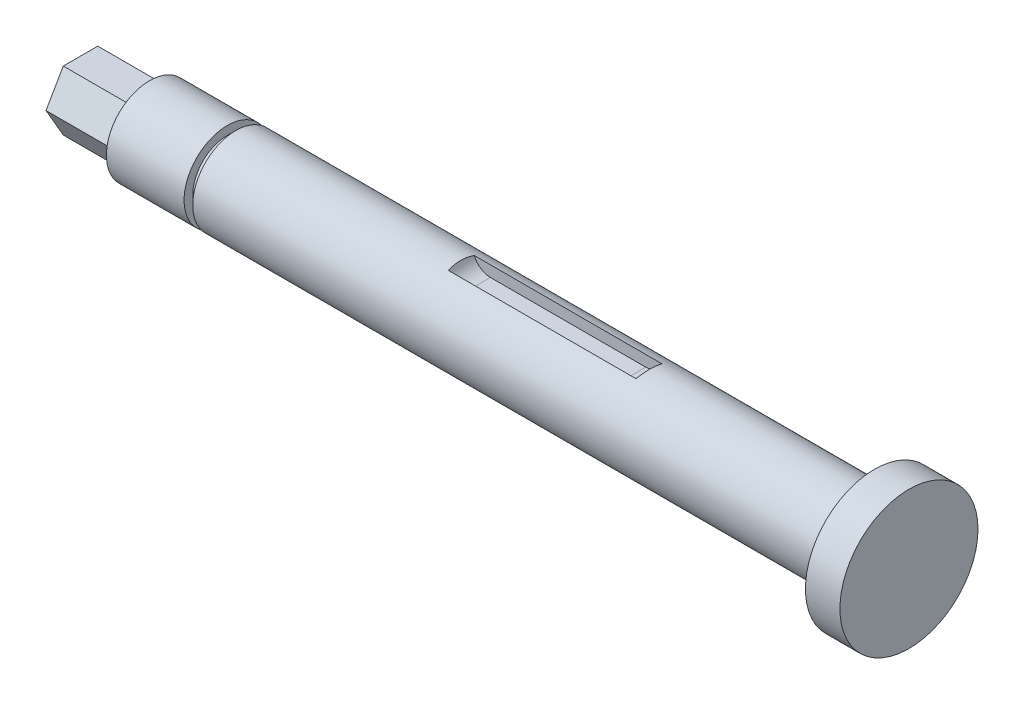
ISO-10303-21;
HEADER;
FILE_DESCRIPTION(('STEP AP214'),'2;1');
FILE_NAME('part.step','',(''),(''),'','','');
FILE_SCHEMA(('AUTOMOTIVE_DESIGN { 1 0 10303 214 1 1 1 1 }'));
ENDSEC;
DATA;
#1=APPLICATION_CONTEXT('core data for automotive mechanical design processes');
#2=APPLICATION_PROTOCOL_DEFINITION('international standard','automotive_design',2000,#1);
#3=PRODUCT_CONTEXT('',#1,'mechanical');
#4=PRODUCT('Part','Part','',(#3));
#5=PRODUCT_RELATED_PRODUCT_CATEGORY('part','',(#4));
#6=PRODUCT_DEFINITION_FORMATION('','',#4);
#7=PRODUCT_DEFINITION_CONTEXT('part definition',#1,'design');
#8=PRODUCT_DEFINITION('design','',#6,#7);
#9=PRODUCT_DEFINITION_SHAPE('','',#8);
#10=(LENGTH_UNIT() NAMED_UNIT(*) SI_UNIT(.MILLI.,.METRE.));
#11=(NAMED_UNIT(*) PLANE_ANGLE_UNIT() SI_UNIT($,.RADIAN.));
#12=(NAMED_UNIT(*) SI_UNIT($,.STERADIAN.) SOLID_ANGLE_UNIT());
#13=UNCERTAINTY_MEASURE_WITH_UNIT(LENGTH_MEASURE(1.E-05),#10,'distance_accuracy_value','');
#14=(GEOMETRIC_REPRESENTATION_CONTEXT(3) GLOBAL_UNCERTAINTY_ASSIGNED_CONTEXT((#13)) GLOBAL_UNIT_ASSIGNED_CONTEXT((#10,
#11,#12)) REPRESENTATION_CONTEXT('',''));
#15=CARTESIAN_POINT('',(0.,0.,0.));
#16=DIRECTION('',(0.,0.,1.));
#17=DIRECTION('',(1.,0.,0.));
#18=AXIS2_PLACEMENT_3D('',#15,#16,#17);
#19=CARTESIAN_POINT('',(0.,0.,0.));
#20=DIRECTION('',(1.,0.,0.));
#21=DIRECTION('',(0.,0.,-1.));
#22=AXIS2_PLACEMENT_3D('',#19,#20,#21);
#23=CYLINDRICAL_SURFACE('',#22,7.9375);
#24=CARTESIAN_POINT('',(28.575,0.,0.));
#25=DIRECTION('',(1.,0.,0.));
#26=DIRECTION('',(0.,0.,-1.));
#27=AXIS2_PLACEMENT_3D('',#24,#25,#26);
#28=CIRCLE('',#27,7.9375);
#29=CARTESIAN_POINT('',(28.575,0.,-7.9375));
#30=VERTEX_POINT('',#29);
#31=EDGE_CURVE('E184',#30,#30,#28,.T.);
#32=ORIENTED_EDGE('',*,*,#31,.T.);
#33=EDGE_LOOP('',(#32));
#34=FACE_BOUND('',#33,.T.);
#35=CARTESIAN_POINT('',(146.05,0.,0.));
#36=DIRECTION('',(1.,0.,0.));
#37=DIRECTION('',(0.,0.,-1.));
#38=AXIS2_PLACEMENT_3D('',#35,#36,#37);
#39=CIRCLE('',#38,7.9375);
#40=CARTESIAN_POINT('',(146.05,0.,-7.9375));
#41=VERTEX_POINT('',#40);
#42=EDGE_CURVE('E181',#41,#41,#39,.T.);
#43=ORIENTED_EDGE('',*,*,#42,.F.);
#44=EDGE_LOOP('',(#43));
#45=FACE_BOUND('',#44,.T.);
#46=CARTESIAN_POINT('',(70.0667575318649,7.57189241124701,-2.38125));
#47=CARTESIAN_POINT('',(70.0547077003656,7.60283748159561,-2.28286114644571));
#48=CARTESIAN_POINT('',(70.0439278662388,7.63190103640766,-2.18373394589652));
#49=CARTESIAN_POINT('',(70.0245768049551,7.68618284099056,-1.98423094459988));
#50=CARTESIAN_POINT('',(70.0160053112933,7.71140155461096,-1.88385529605055));
#51=CARTESIAN_POINT('',(70.0007406043774,7.75790730479949,-1.68210998868868));
#52=CARTESIAN_POINT('',(69.9940464557926,7.77919629741933,-1.58074085099974));
#53=CARTESIAN_POINT('',(69.9822696330404,7.81780480710202,-1.37716069329767));
#54=CARTESIAN_POINT('',(69.9771870047471,7.83512421116124,-1.2749496494035));
#55=CARTESIAN_POINT('',(69.9642408857745,7.88028783199857,-0.972518602068041));
#56=CARTESIAN_POINT('',(69.9583162704699,7.90252061667355,-0.771346365920778));
#57=CARTESIAN_POINT('',(69.9506794210857,7.9315547521132,-0.36781219202664));
#58=CARTESIAN_POINT('',(69.9489677390323,7.93835408060337,-0.165450101853544));
#59=CARTESIAN_POINT('',(69.949442775625,7.93650243379859,0.23320951295324));
#60=CARTESIAN_POINT('',(69.9515157047947,7.92830242011708,0.429509408207363));
#61=CARTESIAN_POINT('',(69.9596947493576,7.89737846148739,0.820870390108008));
#62=CARTESIAN_POINT('',(69.9658001587861,7.87465705881517,1.01593168756149));
#63=CARTESIAN_POINT('',(69.9788488663797,7.82945029286182,1.30909544958883));
#64=CARTESIAN_POINT('',(69.9839338818715,7.81224594563471,1.40812396106605));
#65=CARTESIAN_POINT('',(69.9956400417717,7.77410905883621,1.60537279101093));
#66=CARTESIAN_POINT('',(70.0022611439788,7.7531766216913,1.70359313160493));
#67=CARTESIAN_POINT('',(70.0172851652547,7.70762154640837,1.89909267282386));
#68=CARTESIAN_POINT('',(70.0256890236686,7.68299696487048,1.99637134891407));
#69=CARTESIAN_POINT('',(70.0445825527755,7.63013554179114,2.18974831448237));
#70=CARTESIAN_POINT('',(70.0550724600671,7.60189829063224,2.28584646875236));
#71=CARTESIAN_POINT('',(70.0667575318649,7.57189241124701,2.38125));
#72=B_SPLINE_CURVE_WITH_KNOTS('',3,(#46,#47,#48,#49,#50,#51,#52,#53,#54,#55,#56,#57,#58,#59,#60,
#61,#62,#63,#64,#65,#66,#67,#68,#69,#70,#71),.UNSPECIFIED.,.F.,.F.,(4,2,2,2,2,2,2,2,2,2,2,2,4),
(0.,0.311486004627484,0.622934401155595,0.934227351103229,1.24552916163333,1.85227877141674,
2.45910788014201,3.04799138422072,3.63677182003086,3.93862384263224,4.24046757335365,
4.54247074416797,4.8445081875833),.UNSPECIFIED.);
#73=CARTESIAN_POINT('',(70.0667575318649,7.57189241124701,-2.38125));
#74=VERTEX_POINT('',#73);
#75=CARTESIAN_POINT('',(70.0667575318649,7.57189241124701,2.38125));
#76=VERTEX_POINT('',#75);
#77=EDGE_CURVE('E201',#74,#76,#72,.T.);
#78=ORIENTED_EDGE('',*,*,#77,.F.);
#79=DIRECTION('',(1.,0.,0.));
#80=VECTOR('',#79,1.);
#81=CARTESIAN_POINT('',(0.,7.57189241124701,-2.38125));
#82=LINE('',#81,#80);
#83=CARTESIAN_POINT('',(104.558242468135,7.57189241124701,-2.38125));
#84=VERTEX_POINT('',#83);
#85=EDGE_CURVE('E12',#74,#84,#82,.T.);
#86=ORIENTED_EDGE('',*,*,#85,.T.);
#87=CARTESIAN_POINT('',(104.558242468135,7.57189241124701,2.38125));
#88=CARTESIAN_POINT('',(104.570292299634,7.60283748159561,2.2828611464457));
#89=CARTESIAN_POINT('',(104.581072133761,7.63190103640766,2.18373394589652));
#90=CARTESIAN_POINT('',(104.600423195045,7.68618284099056,1.98423094459988));
#91=CARTESIAN_POINT('',(104.608994688707,7.71140155461096,1.88385529605055));
#92=CARTESIAN_POINT('',(104.624259395623,7.75790730479949,1.68210998868868));
#93=CARTESIAN_POINT('',(104.630953544207,7.77919629741933,1.58074085099974));
#94=CARTESIAN_POINT('',(104.64273036696,7.81780480710202,1.37716069329767));
#95=CARTESIAN_POINT('',(104.647812995253,7.83512421116124,1.27494964940349));
#96=CARTESIAN_POINT('',(104.660759114225,7.88028783199857,0.972518602068041));
#97=CARTESIAN_POINT('',(104.66668372953,7.90252061667355,0.771346365920778));
#98=CARTESIAN_POINT('',(104.674320578914,7.93155475211319,0.36781219202664));
#99=CARTESIAN_POINT('',(104.676032260968,7.93835408060337,0.165450101853544));
#100=CARTESIAN_POINT('',(104.675557224375,7.93650243379859,-0.233209512953239));
#101=CARTESIAN_POINT('',(104.673484295205,7.92830242011708,-0.429509408207361));
#102=CARTESIAN_POINT('',(104.665305250642,7.89737846148739,-0.820870390108007));
#103=CARTESIAN_POINT('',(104.659199841214,7.87465705881517,-1.01593168756148));
#104=CARTESIAN_POINT('',(104.64615113362,7.82945029286182,-1.30909544958883));
#105=CARTESIAN_POINT('',(104.641066118128,7.81224594563471,-1.40812396106605));
#106=CARTESIAN_POINT('',(104.629359958228,7.77410905883621,-1.60537279101093));
#107=CARTESIAN_POINT('',(104.622738856021,7.7531766216913,-1.70359313160493));
#108=CARTESIAN_POINT('',(104.607714834745,7.70762154640837,-1.89909267282387));
#109=CARTESIAN_POINT('',(104.599310976331,7.68299696487047,-1.99637134891407));
#110=CARTESIAN_POINT('',(104.580417447224,7.63013554179114,-2.18974831448237));
#111=CARTESIAN_POINT('',(104.569927539933,7.60189829063224,-2.28584646875236));
#112=CARTESIAN_POINT('',(104.558242468135,7.57189241124701,-2.38125));
#113=B_SPLINE_CURVE_WITH_KNOTS('',3,(#87,#88,#89,#90,#91,#92,#93,#94,#95,#96,#97,#98,#99,#100,
#101,#102,#103,#104,#105,#106,#107,#108,#109,#110,#111,#112),.UNSPECIFIED.,.F.,.F.,(4,2,2,2,2,2,
2,2,2,2,2,2,4),(0.,0.311486004627486,0.622934401155595,0.934227351103228,1.24552916163332,
1.85227877141674,2.459107880142,3.04799138422071,3.63677182003086,3.93862384263224,
4.24046757335365,4.54247074416797,4.84450818758329),.UNSPECIFIED.);
#114=CARTESIAN_POINT('',(104.558242468135,7.57189241124701,2.38125));
#115=VERTEX_POINT('',#114);
#116=EDGE_CURVE('E43',#115,#84,#113,.T.);
#117=ORIENTED_EDGE('',*,*,#116,.F.);
#118=DIRECTION('',(1.,0.,0.));
#119=VECTOR('',#118,1.);
#120=CARTESIAN_POINT('',(0.,7.57189241124701,2.38125));
#121=LINE('',#120,#119);
#122=EDGE_CURVE('E199',#76,#115,#121,.T.);
#123=ORIENTED_EDGE('',*,*,#122,.F.);
#124=EDGE_LOOP('',(#78,#86,#117,#123));
#125=FACE_BOUND('',#124,.T.);
#126=ADVANCED_FACE('F35',(#34,#45,#125),#23,.T.);
#127=CARTESIAN_POINT('',(12.7,6.35,0.));
#128=DIRECTION('',(-1.,0.,0.));
#129=DIRECTION('',(0.,0.,1.));
#130=AXIS2_PLACEMENT_3D('',#127,#128,#129);
#131=PLANE('',#130);
#132=DIRECTION('',(0.,-0.866025403784439,0.5));
#133=VECTOR('',#132,1.);
#134=CARTESIAN_POINT('',(12.7,0.,6.35));
#135=LINE('',#134,#133);
#136=CARTESIAN_POINT('',(12.7,5.49926131403119,3.175));
#137=VERTEX_POINT('',#136);
#138=CARTESIAN_POINT('',(12.7,0.,6.35));
#139=VERTEX_POINT('',#138);
#140=EDGE_CURVE('E58',#137,#139,#135,.T.);
#141=ORIENTED_EDGE('',*,*,#140,.T.);
#142=DIRECTION('',(0.,-0.866025403784439,-0.5));
#143=VECTOR('',#142,1.);
#144=CARTESIAN_POINT('',(12.7,-5.49926131403118,3.175));
#145=LINE('',#144,#143);
#146=CARTESIAN_POINT('',(12.7,-5.49926131403118,3.175));
#147=VERTEX_POINT('',#146);
#148=EDGE_CURVE('E302',#139,#147,#145,.T.);
#149=ORIENTED_EDGE('',*,*,#148,.T.);
#150=DIRECTION('',(0.,0.,-1.));
#151=VECTOR('',#150,1.);
#152=CARTESIAN_POINT('',(12.7,-5.49926131403119,-3.175));
#153=LINE('',#152,#151);
#154=CARTESIAN_POINT('',(12.7,-5.49926131403119,-3.175));
#155=VERTEX_POINT('',#154);
#156=EDGE_CURVE('E306',#147,#155,#153,.T.);
#157=ORIENTED_EDGE('',*,*,#156,.T.);
#158=DIRECTION('',(0.,0.866025403784439,-0.5));
#159=VECTOR('',#158,1.);
#160=CARTESIAN_POINT('',(12.7,0.,-6.35));
#161=LINE('',#160,#159);
#162=CARTESIAN_POINT('',(12.7,0.,-6.35));
#163=VERTEX_POINT('',#162);
#164=EDGE_CURVE('E310',#155,#163,#161,.T.);
#165=ORIENTED_EDGE('',*,*,#164,.T.);
#166=DIRECTION('',(0.,0.866025403784439,0.5));
#167=VECTOR('',#166,1.);
#168=CARTESIAN_POINT('',(12.7,5.49926131403118,-3.175));
#169=LINE('',#168,#167);
#170=CARTESIAN_POINT('',(12.7,5.49926131403118,-3.175));
#171=VERTEX_POINT('',#170);
#172=EDGE_CURVE('E166',#163,#171,#169,.T.);
#173=ORIENTED_EDGE('',*,*,#172,.T.);
#174=DIRECTION('',(0.,0.,1.));
#175=VECTOR('',#174,1.);
#176=CARTESIAN_POINT('',(12.7,5.49926131403119,3.175));
#177=LINE('',#176,#175);
#178=EDGE_CURVE('E115',#171,#137,#177,.T.);
#179=ORIENTED_EDGE('',*,*,#178,.T.);
#180=EDGE_LOOP('',(#141,#149,#157,#165,#173,#179));
#181=FACE_BOUND('',#180,.T.);
#182=CARTESIAN_POINT('',(12.7,0.,0.));
#183=DIRECTION('',(1.,0.,0.));
#184=DIRECTION('',(0.,0.,-1.));
#185=AXIS2_PLACEMENT_3D('',#182,#183,#184);
#186=CIRCLE('',#185,7.9375);
#187=CARTESIAN_POINT('',(12.7,0.,-7.9375));
#188=VERTEX_POINT('',#187);
#189=EDGE_CURVE('E196',#188,#188,#186,.T.);
#190=ORIENTED_EDGE('',*,*,#189,.F.);
#191=EDGE_LOOP('',(#190));
#192=FACE_BOUND('',#191,.T.);
#193=ADVANCED_FACE('F242',(#181,#192),#131,.T.);
#194=CARTESIAN_POINT('',(0.,0.,0.));
#195=DIRECTION('',(1.,0.,0.));
#196=DIRECTION('',(0.,0.,-1.));
#197=AXIS2_PLACEMENT_3D('',#194,#195,#196);
#198=CYLINDRICAL_SURFACE('',#197,7.9375);
#199=ORIENTED_EDGE('',*,*,#189,.T.);
#200=EDGE_LOOP('',(#199));
#201=FACE_BOUND('',#200,.T.);
#202=CARTESIAN_POINT('',(26.9875,0.,0.));
#203=DIRECTION('',(1.,0.,0.));
#204=DIRECTION('',(0.,0.,-1.));
#205=AXIS2_PLACEMENT_3D('',#202,#203,#204);
#206=CIRCLE('',#205,7.9375);
#207=CARTESIAN_POINT('',(26.9875,0.,-7.9375));
#208=VERTEX_POINT('',#207);
#209=EDGE_CURVE('E193',#208,#208,#206,.T.);
#210=ORIENTED_EDGE('',*,*,#209,.F.);
#211=EDGE_LOOP('',(#210));
#212=FACE_BOUND('',#211,.T.);
#213=ADVANCED_FACE('F247',(#201,#212),#198,.T.);
#214=CARTESIAN_POINT('',(26.9875,7.9375,0.));
#215=DIRECTION('',(1.,0.,0.));
#216=DIRECTION('',(0.,0.,-1.));
#217=AXIS2_PLACEMENT_3D('',#214,#215,#216);
#218=PLANE('',#217);
#219=ORIENTED_EDGE('',*,*,#209,.T.);
#220=EDGE_LOOP('',(#219));
#221=FACE_BOUND('',#220,.T.);
#222=CARTESIAN_POINT('',(26.9875,0.,0.));
#223=DIRECTION('',(1.,0.,0.));
#224=DIRECTION('',(0.,0.,-1.));
#225=AXIS2_PLACEMENT_3D('',#222,#223,#224);
#226=CIRCLE('',#225,6.35);
#227=CARTESIAN_POINT('',(26.9875,0.,-6.35));
#228=VERTEX_POINT('',#227);
#229=EDGE_CURVE('E190',#228,#228,#226,.T.);
#230=ORIENTED_EDGE('',*,*,#229,.F.);
#231=EDGE_LOOP('',(#230));
#232=FACE_BOUND('',#231,.T.);
#233=ADVANCED_FACE('F318',(#221,#232),#218,.T.);
#234=CARTESIAN_POINT('',(0.,0.,0.));
#235=DIRECTION('',(1.,0.,0.));
#236=DIRECTION('',(0.,0.,-1.));
#237=AXIS2_PLACEMENT_3D('',#234,#235,#236);
#238=CYLINDRICAL_SURFACE('',#237,6.35);
#239=ORIENTED_EDGE('',*,*,#229,.T.);
#240=EDGE_LOOP('',(#239));
#241=FACE_BOUND('',#240,.T.);
#242=CARTESIAN_POINT('',(28.575,0.,0.));
#243=DIRECTION('',(1.,0.,0.));
#244=DIRECTION('',(0.,0.,-1.));
#245=AXIS2_PLACEMENT_3D('',#242,#243,#244);
#246=CIRCLE('',#245,6.35);
#247=CARTESIAN_POINT('',(28.575,0.,-6.35));
#248=VERTEX_POINT('',#247);
#249=EDGE_CURVE('E187',#248,#248,#246,.T.);
#250=ORIENTED_EDGE('',*,*,#249,.F.);
#251=EDGE_LOOP('',(#250));
#252=FACE_BOUND('',#251,.T.);
#253=ADVANCED_FACE('F238',(#241,#252),#238,.T.);
#254=CARTESIAN_POINT('',(28.575,6.35,0.));
#255=DIRECTION('',(-1.,0.,0.));
#256=DIRECTION('',(0.,0.,1.));
#257=AXIS2_PLACEMENT_3D('',#254,#255,#256);
#258=PLANE('',#257);
#259=ORIENTED_EDGE('',*,*,#249,.T.);
#260=EDGE_LOOP('',(#259));
#261=FACE_BOUND('',#260,.T.);
#262=ORIENTED_EDGE('',*,*,#31,.F.);
#263=EDGE_LOOP('',(#262));
#264=FACE_BOUND('',#263,.T.);
#265=ADVANCED_FACE('F233',(#261,#264),#258,.T.);
#266=CARTESIAN_POINT('',(146.05,7.9375,0.));
#267=DIRECTION('',(-1.,0.,0.));
#268=DIRECTION('',(0.,0.,1.));
#269=AXIS2_PLACEMENT_3D('',#266,#267,#268);
#270=PLANE('',#269);
#271=ORIENTED_EDGE('',*,*,#42,.T.);
#272=EDGE_LOOP('',(#271));
#273=FACE_BOUND('',#272,.T.);
#274=CARTESIAN_POINT('',(146.05,0.,0.));
#275=DIRECTION('',(1.,0.,0.));
#276=DIRECTION('',(0.,0.,-1.));
#277=AXIS2_PLACEMENT_3D('',#274,#275,#276);
#278=CIRCLE('',#277,12.7);
#279=CARTESIAN_POINT('',(146.05,0.,-12.7));
#280=VERTEX_POINT('',#279);
#281=EDGE_CURVE('E178',#280,#280,#278,.T.);
#282=ORIENTED_EDGE('',*,*,#281,.F.);
#283=EDGE_LOOP('',(#282));
#284=FACE_BOUND('',#283,.T.);
#285=ADVANCED_FACE('F230',(#273,#284),#270,.T.);
#286=CARTESIAN_POINT('',(0.,0.,0.));
#287=DIRECTION('',(1.,0.,0.));
#288=DIRECTION('',(0.,0.,-1.));
#289=AXIS2_PLACEMENT_3D('',#286,#287,#288);
#290=CYLINDRICAL_SURFACE('',#289,12.7);
#291=ORIENTED_EDGE('',*,*,#281,.T.);
#292=EDGE_LOOP('',(#291));
#293=FACE_BOUND('',#292,.T.);
#294=CARTESIAN_POINT('',(152.4,0.,0.));
#295=DIRECTION('',(1.,0.,0.));
#296=DIRECTION('',(0.,0.,-1.));
#297=AXIS2_PLACEMENT_3D('',#294,#295,#296);
#298=CIRCLE('',#297,12.7);
#299=CARTESIAN_POINT('',(152.4,0.,-12.7));
#300=VERTEX_POINT('',#299);
#301=EDGE_CURVE('E173',#300,#300,#298,.T.);
#302=ORIENTED_EDGE('',*,*,#301,.F.);
#303=EDGE_LOOP('',(#302));
#304=FACE_BOUND('',#303,.T.);
#305=ADVANCED_FACE('F227',(#293,#304),#290,.T.);
#306=CARTESIAN_POINT('',(152.4,12.7,0.));
#307=DIRECTION('',(1.,0.,0.));
#308=DIRECTION('',(0.,0.,-1.));
#309=AXIS2_PLACEMENT_3D('',#306,#307,#308);
#310=PLANE('',#309);
#311=ORIENTED_EDGE('',*,*,#301,.T.);
#312=EDGE_LOOP('',(#311));
#313=FACE_BOUND('',#312,.T.);
#314=ADVANCED_FACE('F223',(#313),#310,.T.);
#315=CARTESIAN_POINT('',(101.6,8.7249,-2.38125));
#316=DIRECTION('',(0.,0.,1.));
#317=DIRECTION('',(1.,0.,0.));
#318=AXIS2_PLACEMENT_3D('',#315,#316,#317);
#319=CYLINDRICAL_SURFACE('',#318,3.17500000000001);
#320=ORIENTED_EDGE('',*,*,#116,.T.);
#321=CARTESIAN_POINT('',(101.6,8.7249,-2.38125));
#322=DIRECTION('',(0.,0.,1.));
#323=DIRECTION('',(1.,0.,0.));
#324=AXIS2_PLACEMENT_3D('',#321,#322,#323);
#325=CIRCLE('',#324,3.17500000000001);
#326=CARTESIAN_POINT('',(101.6,5.5499,-2.38125));
#327=VERTEX_POINT('',#326);
#328=EDGE_CURVE('E159',#327,#84,#325,.T.);
#329=ORIENTED_EDGE('',*,*,#328,.F.);
#330=DIRECTION('',(0.,0.,1.));
#331=VECTOR('',#330,1.);
#332=CARTESIAN_POINT('',(101.6,5.5499,-2.38125));
#333=LINE('',#332,#331);
#334=CARTESIAN_POINT('',(101.6,5.5499,2.38125));
#335=VERTEX_POINT('',#334);
#336=EDGE_CURVE('E171',#327,#335,#333,.T.);
#337=ORIENTED_EDGE('',*,*,#336,.T.);
#338=CARTESIAN_POINT('',(101.6,8.7249,2.38125));
#339=DIRECTION('',(0.,0.,1.));
#340=DIRECTION('',(1.,0.,0.));
#341=AXIS2_PLACEMENT_3D('',#338,#339,#340);
#342=CIRCLE('',#341,3.17500000000001);
#343=EDGE_CURVE('E156',#335,#115,#342,.T.);
#344=ORIENTED_EDGE('',*,*,#343,.T.);
#345=EDGE_LOOP('',(#320,#329,#337,#344));
#346=FACE_BOUND('',#345,.T.);
#347=ADVANCED_FACE('F226',(#346),#319,.F.);
#348=CARTESIAN_POINT('',(73.025,5.5499,-2.38125));
#349=DIRECTION('',(0.,-1.,0.));
#350=DIRECTION('',(1.,0.,0.));
#351=AXIS2_PLACEMENT_3D('',#348,#349,#350);
#352=PLANE('',#351);
#353=DIRECTION('',(1.,0.,0.));
#354=VECTOR('',#353,1.);
#355=CARTESIAN_POINT('',(73.025,5.5499,2.38125));
#356=LINE('',#355,#354);
#357=CARTESIAN_POINT('',(73.025,5.5499,2.38125));
#358=VERTEX_POINT('',#357);
#359=EDGE_CURVE('E165',#358,#335,#356,.T.);
#360=ORIENTED_EDGE('',*,*,#359,.T.);
#361=ORIENTED_EDGE('',*,*,#336,.F.);
#362=DIRECTION('',(1.,0.,0.));
#363=VECTOR('',#362,1.);
#364=CARTESIAN_POINT('',(73.025,5.5499,-2.38125));
#365=LINE('',#364,#363);
#366=CARTESIAN_POINT('',(73.025,5.5499,-2.38125));
#367=VERTEX_POINT('',#366);
#368=EDGE_CURVE('E155',#367,#327,#365,.T.);
#369=ORIENTED_EDGE('',*,*,#368,.F.);
#370=DIRECTION('',(0.,0.,1.));
#371=VECTOR('',#370,1.);
#372=CARTESIAN_POINT('',(73.025,5.5499,-2.38125));
#373=LINE('',#372,#371);
#374=EDGE_CURVE('E162',#367,#358,#373,.T.);
#375=ORIENTED_EDGE('',*,*,#374,.T.);
#376=EDGE_LOOP('',(#360,#361,#369,#375));
#377=FACE_BOUND('',#376,.T.);
#378=ADVANCED_FACE('F221',(#377),#352,.F.);
#379=CARTESIAN_POINT('',(73.025,8.7249,-2.38125));
#380=DIRECTION('',(0.,0.,1.));
#381=DIRECTION('',(1.,0.,0.));
#382=AXIS2_PLACEMENT_3D('',#379,#380,#381);
#383=CYLINDRICAL_SURFACE('',#382,3.175);
#384=ORIENTED_EDGE('',*,*,#77,.T.);
#385=CARTESIAN_POINT('',(73.025,8.7249,2.38125));
#386=DIRECTION('',(0.,0.,1.));
#387=DIRECTION('',(1.,0.,0.));
#388=AXIS2_PLACEMENT_3D('',#385,#386,#387);
#389=CIRCLE('',#388,3.175);
#390=EDGE_CURVE('E163',#76,#358,#389,.T.);
#391=ORIENTED_EDGE('',*,*,#390,.T.);
#392=ORIENTED_EDGE('',*,*,#374,.F.);
#393=CARTESIAN_POINT('',(73.025,8.7249,-2.38125));
#394=DIRECTION('',(0.,0.,1.));
#395=DIRECTION('',(1.,0.,0.));
#396=AXIS2_PLACEMENT_3D('',#393,#394,#395);
#397=CIRCLE('',#396,3.175);
#398=EDGE_CURVE('E153',#74,#367,#397,.T.);
#399=ORIENTED_EDGE('',*,*,#398,.F.);
#400=EDGE_LOOP('',(#384,#391,#392,#399));
#401=FACE_BOUND('',#400,.T.);
#402=ADVANCED_FACE('F215',(#401),#383,.F.);
#403=CARTESIAN_POINT('',(73.025,8.7249,-2.38125));
#404=DIRECTION('',(0.,0.,1.));
#405=DIRECTION('',(1.,0.,0.));
#406=AXIS2_PLACEMENT_3D('',#403,#404,#405);
#407=PLANE('',#406);
#408=ORIENTED_EDGE('',*,*,#398,.T.);
#409=ORIENTED_EDGE('',*,*,#368,.T.);
#410=ORIENTED_EDGE('',*,*,#328,.T.);
#411=ORIENTED_EDGE('',*,*,#85,.F.);
#412=EDGE_LOOP('',(#408,#409,#410,#411));
#413=FACE_BOUND('',#412,.T.);
#414=ADVANCED_FACE('F220',(#413),#407,.T.);
#415=CARTESIAN_POINT('',(73.025,8.7249,2.38125));
#416=DIRECTION('',(0.,0.,1.));
#417=DIRECTION('',(1.,0.,0.));
#418=AXIS2_PLACEMENT_3D('',#415,#416,#417);
#419=PLANE('',#418);
#420=ORIENTED_EDGE('',*,*,#122,.T.);
#421=ORIENTED_EDGE('',*,*,#343,.F.);
#422=ORIENTED_EDGE('',*,*,#359,.F.);
#423=ORIENTED_EDGE('',*,*,#390,.F.);
#424=EDGE_LOOP('',(#420,#421,#422,#423));
#425=FACE_BOUND('',#424,.T.);
#426=ADVANCED_FACE('F264',(#425),#419,.F.);
#427=CARTESIAN_POINT('',(48.9802347291194,5.49926131403119,3.175));
#428=DIRECTION('',(0.,1.,0.));
#429=DIRECTION('',(0.,0.,1.));
#430=AXIS2_PLACEMENT_3D('',#427,#428,#429);
#431=PLANE('',#430);
#432=DIRECTION('',(-1.,0.,0.));
#433=VECTOR('',#432,1.);
#434=CARTESIAN_POINT('',(48.9802347291194,5.49926131403118,-3.175));
#435=LINE('',#434,#433);
#436=CARTESIAN_POINT('',(0.,5.49926131403118,-3.175));
#437=VERTEX_POINT('',#436);
#438=EDGE_CURVE('E112',#171,#437,#435,.T.);
#439=ORIENTED_EDGE('',*,*,#438,.T.);
#440=DIRECTION('',(0.,0.,-1.));
#441=VECTOR('',#440,1.);
#442=CARTESIAN_POINT('',(0.,5.49926131403119,3.175));
#443=LINE('',#442,#441);
#444=CARTESIAN_POINT('',(0.,5.49926131403119,3.175));
#445=VERTEX_POINT('',#444);
#446=EDGE_CURVE('E50',#445,#437,#443,.T.);
#447=ORIENTED_EDGE('',*,*,#446,.F.);
#448=DIRECTION('',(-1.,0.,0.));
#449=VECTOR('',#448,1.);
#450=CARTESIAN_POINT('',(48.9802347291194,5.49926131403119,3.175));
#451=LINE('',#450,#449);
#452=EDGE_CURVE('E119',#137,#445,#451,.T.);
#453=ORIENTED_EDGE('',*,*,#452,.F.);
#454=ORIENTED_EDGE('',*,*,#178,.F.);
#455=EDGE_LOOP('',(#439,#447,#453,#454));
#456=FACE_BOUND('',#455,.T.);
#457=ADVANCED_FACE('F114',(#456),#431,.T.);
#458=CARTESIAN_POINT('',(48.9802347291194,5.49926131403118,-3.175));
#459=DIRECTION('',(0.,0.5,-0.866025403784439));
#460=DIRECTION('',(0.,0.866025403784439,0.5));
#461=AXIS2_PLACEMENT_3D('',#458,#459,#460);
#462=PLANE('',#461);
#463=DIRECTION('',(-1.,0.,0.));
#464=VECTOR('',#463,1.);
#465=CARTESIAN_POINT('',(48.9802347291194,0.,-6.35));
#466=LINE('',#465,#464);
#467=CARTESIAN_POINT('',(0.,0.,-6.35));
#468=VERTEX_POINT('',#467);
#469=EDGE_CURVE('E118',#163,#468,#466,.T.);
#470=ORIENTED_EDGE('',*,*,#469,.T.);
#471=DIRECTION('',(0.,-0.866025403784439,-0.5));
#472=VECTOR('',#471,1.);
#473=CARTESIAN_POINT('',(0.,5.49926131403118,-3.175));
#474=LINE('',#473,#472);
#475=EDGE_CURVE('E122',#437,#468,#474,.T.);
#476=ORIENTED_EDGE('',*,*,#475,.F.);
#477=ORIENTED_EDGE('',*,*,#438,.F.);
#478=ORIENTED_EDGE('',*,*,#172,.F.);
#479=EDGE_LOOP('',(#470,#476,#477,#478));
#480=FACE_BOUND('',#479,.T.);
#481=ADVANCED_FACE('F123',(#480),#462,.T.);
#482=CARTESIAN_POINT('',(48.9802347291194,0.,-6.35));
#483=DIRECTION('',(0.,-0.5,-0.866025403784438));
#484=DIRECTION('',(0.,0.866025403784439,-0.5));
#485=AXIS2_PLACEMENT_3D('',#482,#483,#484);
#486=PLANE('',#485);
#487=DIRECTION('',(-1.,0.,0.));
#488=VECTOR('',#487,1.);
#489=CARTESIAN_POINT('',(48.9802347291194,-5.49926131403119,-3.175));
#490=LINE('',#489,#488);
#491=CARTESIAN_POINT('',(0.,-5.49926131403119,-3.175));
#492=VERTEX_POINT('',#491);
#493=EDGE_CURVE('E148',#155,#492,#490,.T.);
#494=ORIENTED_EDGE('',*,*,#493,.T.);
#495=DIRECTION('',(0.,-0.866025403784438,0.5));
#496=VECTOR('',#495,1.);
#497=CARTESIAN_POINT('',(0.,0.,-6.35));
#498=LINE('',#497,#496);
#499=EDGE_CURVE('E128',#468,#492,#498,.T.);
#500=ORIENTED_EDGE('',*,*,#499,.F.);
#501=ORIENTED_EDGE('',*,*,#469,.F.);
#502=ORIENTED_EDGE('',*,*,#164,.F.);
#503=EDGE_LOOP('',(#494,#500,#501,#502));
#504=FACE_BOUND('',#503,.T.);
#505=ADVANCED_FACE('F287',(#504),#486,.T.);
#506=CARTESIAN_POINT('',(48.9802347291194,-5.49926131403119,-3.175));
#507=DIRECTION('',(0.,-1.,0.));
#508=DIRECTION('',(0.,0.,-1.));
#509=AXIS2_PLACEMENT_3D('',#506,#507,#508);
#510=PLANE('',#509);
#511=DIRECTION('',(-1.,0.,0.));
#512=VECTOR('',#511,1.);
#513=CARTESIAN_POINT('',(48.9802347291194,-5.49926131403118,3.175));
#514=LINE('',#513,#512);
#515=CARTESIAN_POINT('',(0.,-5.49926131403118,3.175));
#516=VERTEX_POINT('',#515);
#517=EDGE_CURVE('E146',#147,#516,#514,.T.);
#518=ORIENTED_EDGE('',*,*,#517,.T.);
#519=DIRECTION('',(0.,0.,1.));
#520=VECTOR('',#519,1.);
#521=CARTESIAN_POINT('',(0.,-5.49926131403119,-3.175));
#522=LINE('',#521,#520);
#523=EDGE_CURVE('E139',#492,#516,#522,.T.);
#524=ORIENTED_EDGE('',*,*,#523,.F.);
#525=ORIENTED_EDGE('',*,*,#493,.F.);
#526=ORIENTED_EDGE('',*,*,#156,.F.);
#527=EDGE_LOOP('',(#518,#524,#525,#526));
#528=FACE_BOUND('',#527,.T.);
#529=ADVANCED_FACE('F290',(#528),#510,.T.);
#530=CARTESIAN_POINT('',(48.9802347291194,-5.49926131403118,3.175));
#531=DIRECTION('',(0.,-0.5,0.866025403784439));
#532=DIRECTION('',(0.,-0.866025403784439,-0.5));
#533=AXIS2_PLACEMENT_3D('',#530,#531,#532);
#534=PLANE('',#533);
#535=DIRECTION('',(-1.,0.,0.));
#536=VECTOR('',#535,1.);
#537=CARTESIAN_POINT('',(48.9802347291194,0.,6.35));
#538=LINE('',#537,#536);
#539=CARTESIAN_POINT('',(0.,0.,6.35));
#540=VERTEX_POINT('',#539);
#541=EDGE_CURVE('E144',#139,#540,#538,.T.);
#542=ORIENTED_EDGE('',*,*,#541,.T.);
#543=DIRECTION('',(0.,0.866025403784439,0.5));
#544=VECTOR('',#543,1.);
#545=CARTESIAN_POINT('',(0.,-5.49926131403118,3.175));
#546=LINE('',#545,#544);
#547=EDGE_CURVE('E142',#516,#540,#546,.T.);
#548=ORIENTED_EDGE('',*,*,#547,.F.);
#549=ORIENTED_EDGE('',*,*,#517,.F.);
#550=ORIENTED_EDGE('',*,*,#148,.F.);
#551=EDGE_LOOP('',(#542,#548,#549,#550));
#552=FACE_BOUND('',#551,.T.);
#553=ADVANCED_FACE('F281',(#552),#534,.T.);
#554=CARTESIAN_POINT('',(48.9802347291194,0.,6.35));
#555=DIRECTION('',(0.,0.5,0.866025403784438));
#556=DIRECTION('',(0.,-0.866025403784439,0.5));
#557=AXIS2_PLACEMENT_3D('',#554,#555,#556);
#558=PLANE('',#557);
#559=ORIENTED_EDGE('',*,*,#452,.T.);
#560=DIRECTION('',(0.,0.866025403784439,-0.5));
#561=VECTOR('',#560,1.);
#562=CARTESIAN_POINT('',(0.,0.,6.35));
#563=LINE('',#562,#561);
#564=EDGE_CURVE('E133',#540,#445,#563,.T.);
#565=ORIENTED_EDGE('',*,*,#564,.F.);
#566=ORIENTED_EDGE('',*,*,#541,.F.);
#567=ORIENTED_EDGE('',*,*,#140,.F.);
#568=EDGE_LOOP('',(#559,#565,#566,#567));
#569=FACE_BOUND('',#568,.T.);
#570=ADVANCED_FACE('F278',(#569),#558,.T.);
#571=CARTESIAN_POINT('',(0.,0.,0.));
#572=DIRECTION('',(-1.,0.,0.));
#573=DIRECTION('',(0.,0.,1.));
#574=AXIS2_PLACEMENT_3D('',#571,#572,#573);
#575=PLANE('',#574);
#576=ORIENTED_EDGE('',*,*,#564,.T.);
#577=ORIENTED_EDGE('',*,*,#446,.T.);
#578=ORIENTED_EDGE('',*,*,#475,.T.);
#579=ORIENTED_EDGE('',*,*,#499,.T.);
#580=ORIENTED_EDGE('',*,*,#523,.T.);
#581=ORIENTED_EDGE('',*,*,#547,.T.);
#582=EDGE_LOOP('',(#576,#577,#578,#579,#580,#581));
#583=FACE_BOUND('',#582,.T.);
#584=ADVANCED_FACE('F37',(#583),#575,.T.);
#585=CLOSED_SHELL('',(#126,#193,#213,#233,#253,#265,#285,#305,#314,#347,#378,#402,#414,#426,
#457,#481,#505,#529,#553,#570,#584));
#586=MANIFOLD_SOLID_BREP('B2',#585);
#587=ADVANCED_BREP_SHAPE_REPRESENTATION('',(#18,#586),#14);
#588=SHAPE_DEFINITION_REPRESENTATION(#9,#587);
ENDSEC;
END-ISO-10303-21;
